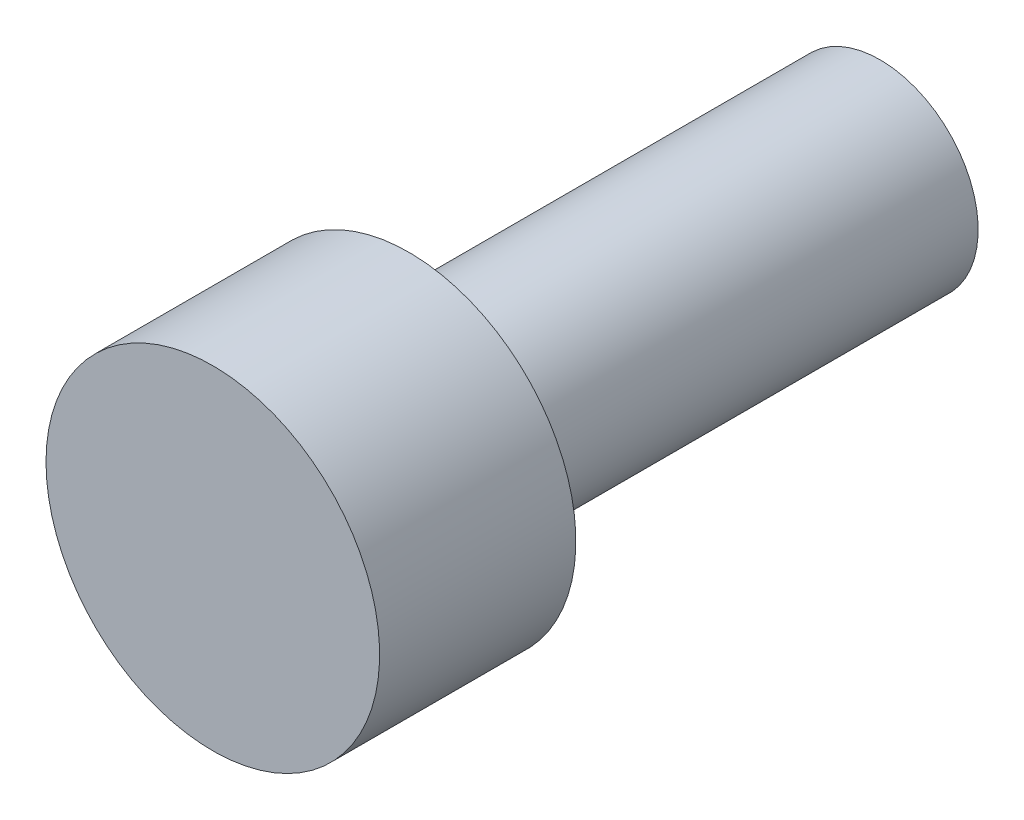
ISO-10303-21;
HEADER;
FILE_DESCRIPTION(('STEP AP214'),'2;1');
FILE_NAME('part.step','',(''),(''),'','','');
FILE_SCHEMA(('AUTOMOTIVE_DESIGN { 1 0 10303 214 1 1 1 1 }'));
ENDSEC;
DATA;
#1=APPLICATION_CONTEXT('core data for automotive mechanical design processes');
#2=APPLICATION_PROTOCOL_DEFINITION('international standard','automotive_design',2000,#1);
#3=PRODUCT_CONTEXT('',#1,'mechanical');
#4=PRODUCT('Part','Part','',(#3));
#5=PRODUCT_RELATED_PRODUCT_CATEGORY('part','',(#4));
#6=PRODUCT_DEFINITION_FORMATION('','',#4);
#7=PRODUCT_DEFINITION_CONTEXT('part definition',#1,'design');
#8=PRODUCT_DEFINITION('design','',#6,#7);
#9=PRODUCT_DEFINITION_SHAPE('','',#8);
#10=(LENGTH_UNIT() NAMED_UNIT(*) SI_UNIT(.MILLI.,.METRE.));
#11=(NAMED_UNIT(*) PLANE_ANGLE_UNIT() SI_UNIT($,.RADIAN.));
#12=(NAMED_UNIT(*) SI_UNIT($,.STERADIAN.) SOLID_ANGLE_UNIT());
#13=UNCERTAINTY_MEASURE_WITH_UNIT(LENGTH_MEASURE(1.E-05),#10,'distance_accuracy_value','');
#14=(GEOMETRIC_REPRESENTATION_CONTEXT(3) GLOBAL_UNCERTAINTY_ASSIGNED_CONTEXT((#13)) GLOBAL_UNIT_ASSIGNED_CONTEXT((#10,
#11,#12)) REPRESENTATION_CONTEXT('',''));
#15=CARTESIAN_POINT('',(0.,0.,0.));
#16=DIRECTION('',(0.,0.,1.));
#17=DIRECTION('',(1.,0.,0.));
#18=AXIS2_PLACEMENT_3D('',#15,#16,#17);
#19=CARTESIAN_POINT('',(0.,0.,5.));
#20=DIRECTION('',(0.,0.,-1.));
#21=DIRECTION('',(-1.,0.,0.));
#22=AXIS2_PLACEMENT_3D('',#19,#20,#21);
#23=PLANE('',#22);
#24=CARTESIAN_POINT('',(0.,0.,5.));
#25=DIRECTION('',(0.,0.,-1.));
#26=DIRECTION('',(-1.,0.,0.));
#27=AXIS2_PLACEMENT_3D('',#24,#25,#26);
#28=CIRCLE('',#27,4.25);
#29=CARTESIAN_POINT('',(-4.25000000000001,0.,5.));
#30=VERTEX_POINT('',#29);
#31=EDGE_CURVE('E10',#30,#30,#28,.T.);
#32=ORIENTED_EDGE('',*,*,#31,.F.);
#33=EDGE_LOOP('',(#32));
#34=FACE_BOUND('',#33,.T.);
#35=ADVANCED_FACE('F34',(#34),#23,.F.);
#36=CARTESIAN_POINT('',(0.,0.,-12.));
#37=DIRECTION('',(0.,0.,-1.));
#38=DIRECTION('',(-1.,0.,0.));
#39=AXIS2_PLACEMENT_3D('',#36,#37,#38);
#40=CYLINDRICAL_SURFACE('',#39,4.25);
#41=CARTESIAN_POINT('',(0.,0.,0.));
#42=DIRECTION('',(0.,0.,-1.));
#43=DIRECTION('',(-1.,0.,0.));
#44=AXIS2_PLACEMENT_3D('',#41,#42,#43);
#45=CIRCLE('',#44,4.25);
#46=CARTESIAN_POINT('',(-4.25000000000001,0.,0.));
#47=VERTEX_POINT('',#46);
#48=EDGE_CURVE('E45',#47,#47,#45,.T.);
#49=ORIENTED_EDGE('',*,*,#48,.F.);
#50=EDGE_LOOP('',(#49));
#51=FACE_BOUND('',#50,.T.);
#52=ORIENTED_EDGE('',*,*,#31,.T.);
#53=EDGE_LOOP('',(#52));
#54=FACE_BOUND('',#53,.T.);
#55=ADVANCED_FACE('F75',(#51,#54),#40,.T.);
#56=CARTESIAN_POINT('',(4.25000000000001,0.,0.));
#57=DIRECTION('',(0.,0.,1.));
#58=DIRECTION('',(1.,0.,0.));
#59=AXIS2_PLACEMENT_3D('',#56,#57,#58);
#60=PLANE('',#59);
#61=CARTESIAN_POINT('',(0.,0.,0.));
#62=DIRECTION('',(0.,0.,-1.));
#63=DIRECTION('',(-1.,0.,0.));
#64=AXIS2_PLACEMENT_3D('',#61,#62,#63);
#65=CIRCLE('',#64,2.5);
#66=CARTESIAN_POINT('',(-2.5,0.,0.));
#67=VERTEX_POINT('',#66);
#68=EDGE_CURVE('E48',#67,#67,#65,.T.);
#69=ORIENTED_EDGE('',*,*,#68,.F.);
#70=EDGE_LOOP('',(#69));
#71=FACE_BOUND('',#70,.T.);
#72=ORIENTED_EDGE('',*,*,#48,.T.);
#73=EDGE_LOOP('',(#72));
#74=FACE_BOUND('',#73,.T.);
#75=ADVANCED_FACE('F67',(#71,#74),#60,.F.);
#76=CARTESIAN_POINT('',(0.,0.,-12.));
#77=DIRECTION('',(0.,0.,-1.));
#78=DIRECTION('',(-1.,0.,0.));
#79=AXIS2_PLACEMENT_3D('',#76,#77,#78);
#80=CYLINDRICAL_SURFACE('',#79,2.5);
#81=CARTESIAN_POINT('',(0.,0.,-12.));
#82=DIRECTION('',(0.,0.,-1.));
#83=DIRECTION('',(-1.,0.,0.));
#84=AXIS2_PLACEMENT_3D('',#81,#82,#83);
#85=CIRCLE('',#84,2.5);
#86=CARTESIAN_POINT('',(-2.5,0.,-12.));
#87=VERTEX_POINT('',#86);
#88=EDGE_CURVE('E53',#87,#87,#85,.T.);
#89=ORIENTED_EDGE('',*,*,#88,.F.);
#90=EDGE_LOOP('',(#89));
#91=FACE_BOUND('',#90,.T.);
#92=ORIENTED_EDGE('',*,*,#68,.T.);
#93=EDGE_LOOP('',(#92));
#94=FACE_BOUND('',#93,.T.);
#95=ADVANCED_FACE('F61',(#91,#94),#80,.T.);
#96=CARTESIAN_POINT('',(2.5,0.,-12.));
#97=DIRECTION('',(0.,0.,1.));
#98=DIRECTION('',(1.,0.,0.));
#99=AXIS2_PLACEMENT_3D('',#96,#97,#98);
#100=PLANE('',#99);
#101=ORIENTED_EDGE('',*,*,#88,.T.);
#102=EDGE_LOOP('',(#101));
#103=FACE_BOUND('',#102,.T.);
#104=ADVANCED_FACE('F65',(#103),#100,.F.);
#105=CLOSED_SHELL('',(#35,#55,#75,#95,#104));
#106=MANIFOLD_SOLID_BREP('B2',#105);
#107=ADVANCED_BREP_SHAPE_REPRESENTATION('',(#18,#106),#14);
#108=SHAPE_DEFINITION_REPRESENTATION(#9,#107);
ENDSEC;
END-ISO-10303-21;
